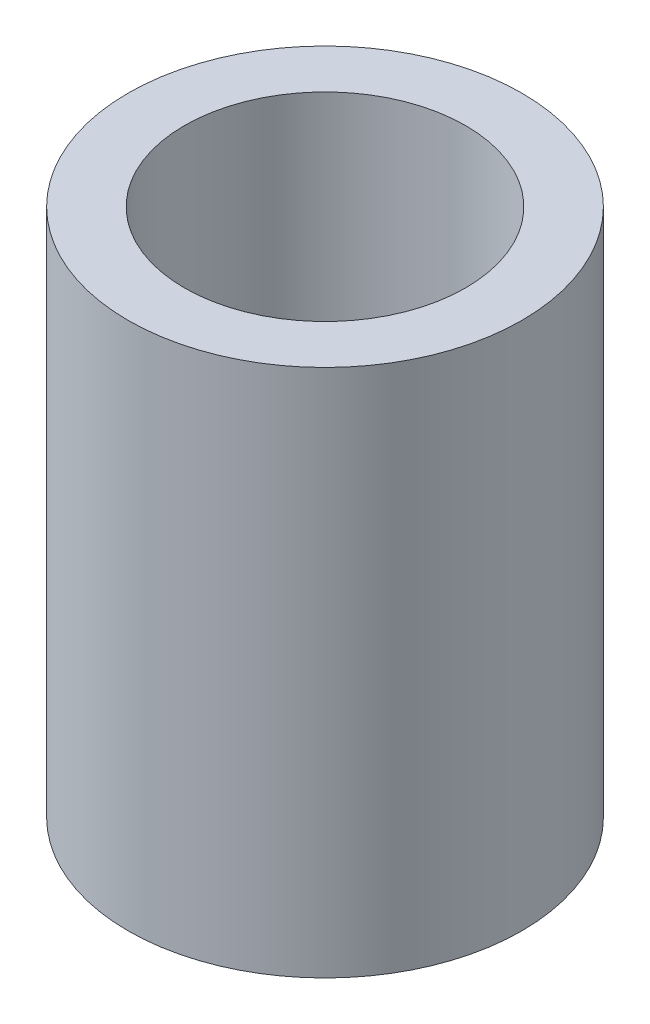
ISO-10303-21;
HEADER;
FILE_DESCRIPTION(('STEP AP214'),'2;1');
FILE_NAME('part.step','',(''),(''),'','','');
FILE_SCHEMA(('AUTOMOTIVE_DESIGN { 1 0 10303 214 1 1 1 1 }'));
ENDSEC;
DATA;
#1=APPLICATION_CONTEXT('core data for automotive mechanical design processes');
#2=APPLICATION_PROTOCOL_DEFINITION('international standard','automotive_design',2000,#1);
#3=PRODUCT_CONTEXT('',#1,'mechanical');
#4=PRODUCT('Part','Part','',(#3));
#5=PRODUCT_RELATED_PRODUCT_CATEGORY('part','',(#4));
#6=PRODUCT_DEFINITION_FORMATION('','',#4);
#7=PRODUCT_DEFINITION_CONTEXT('part definition',#1,'design');
#8=PRODUCT_DEFINITION('design','',#6,#7);
#9=PRODUCT_DEFINITION_SHAPE('','',#8);
#10=(LENGTH_UNIT() NAMED_UNIT(*) SI_UNIT(.MILLI.,.METRE.));
#11=(NAMED_UNIT(*) PLANE_ANGLE_UNIT() SI_UNIT($,.RADIAN.));
#12=(NAMED_UNIT(*) SI_UNIT($,.STERADIAN.) SOLID_ANGLE_UNIT());
#13=UNCERTAINTY_MEASURE_WITH_UNIT(LENGTH_MEASURE(1.E-05),#10,'distance_accuracy_value','');
#14=(GEOMETRIC_REPRESENTATION_CONTEXT(3) GLOBAL_UNCERTAINTY_ASSIGNED_CONTEXT((#13)) GLOBAL_UNIT_ASSIGNED_CONTEXT((#10,
#11,#12)) REPRESENTATION_CONTEXT('',''));
#15=CARTESIAN_POINT('',(0.,0.,0.));
#16=DIRECTION('',(0.,0.,1.));
#17=DIRECTION('',(1.,0.,0.));
#18=AXIS2_PLACEMENT_3D('',#15,#16,#17);
#19=CARTESIAN_POINT('',(0.,9.4,0.));
#20=DIRECTION('',(0.,1.,0.));
#21=DIRECTION('',(0.,0.,1.));
#22=AXIS2_PLACEMENT_3D('',#19,#20,#21);
#23=PLANE('',#22);
#24=CARTESIAN_POINT('',(0.,9.4,0.));
#25=DIRECTION('',(0.,1.,0.));
#26=DIRECTION('',(1.,0.,0.));
#27=AXIS2_PLACEMENT_3D('',#24,#25,#26);
#28=CIRCLE('',#27,3.5);
#29=CARTESIAN_POINT('',(3.5,9.4,0.));
#30=VERTEX_POINT('',#29);
#31=EDGE_CURVE('E11',#30,#30,#28,.T.);
#32=ORIENTED_EDGE('',*,*,#31,.T.);
#33=EDGE_LOOP('',(#32));
#34=FACE_BOUND('',#33,.T.);
#35=CARTESIAN_POINT('',(0.,9.4,0.));
#36=DIRECTION('',(0.,1.,0.));
#37=DIRECTION('',(0.,0.,1.));
#38=AXIS2_PLACEMENT_3D('',#35,#36,#37);
#39=CIRCLE('',#38,2.5);
#40=CARTESIAN_POINT('',(0.,9.4,2.5));
#41=VERTEX_POINT('',#40);
#42=EDGE_CURVE('E48',#41,#41,#39,.T.);
#43=ORIENTED_EDGE('',*,*,#42,.F.);
#44=EDGE_LOOP('',(#43));
#45=FACE_BOUND('',#44,.T.);
#46=ADVANCED_FACE('F37',(#34,#45),#23,.T.);
#47=CARTESIAN_POINT('',(0.,0.,0.));
#48=DIRECTION('',(0.,1.,0.));
#49=DIRECTION('',(0.,0.,1.));
#50=AXIS2_PLACEMENT_3D('',#47,#48,#49);
#51=PLANE('',#50);
#52=CARTESIAN_POINT('',(0.,0.,0.));
#53=DIRECTION('',(0.,1.,0.));
#54=DIRECTION('',(1.,0.,0.));
#55=AXIS2_PLACEMENT_3D('',#52,#53,#54);
#56=CIRCLE('',#55,3.5);
#57=CARTESIAN_POINT('',(3.5,0.,0.));
#58=VERTEX_POINT('',#57);
#59=EDGE_CURVE('E41',#58,#58,#56,.T.);
#60=ORIENTED_EDGE('',*,*,#59,.F.);
#61=EDGE_LOOP('',(#60));
#62=FACE_BOUND('',#61,.T.);
#63=CARTESIAN_POINT('',(0.,0.,0.));
#64=DIRECTION('',(0.,1.,0.));
#65=DIRECTION('',(0.,0.,1.));
#66=AXIS2_PLACEMENT_3D('',#63,#64,#65);
#67=CIRCLE('',#66,2.5);
#68=CARTESIAN_POINT('',(0.,0.,2.5));
#69=VERTEX_POINT('',#68);
#70=EDGE_CURVE('E50',#69,#69,#67,.T.);
#71=ORIENTED_EDGE('',*,*,#70,.T.);
#72=EDGE_LOOP('',(#71));
#73=FACE_BOUND('',#72,.T.);
#74=ADVANCED_FACE('F60',(#62,#73),#51,.F.);
#75=CARTESIAN_POINT('',(0.,9.4,0.));
#76=DIRECTION('',(0.,-1.,0.));
#77=DIRECTION('',(0.,0.,-1.));
#78=AXIS2_PLACEMENT_3D('',#75,#76,#77);
#79=CYLINDRICAL_SURFACE('',#78,3.5);
#80=ORIENTED_EDGE('',*,*,#31,.F.);
#81=EDGE_LOOP('',(#80));
#82=FACE_BOUND('',#81,.T.);
#83=ORIENTED_EDGE('',*,*,#59,.T.);
#84=EDGE_LOOP('',(#83));
#85=FACE_BOUND('',#84,.T.);
#86=ADVANCED_FACE('F39',(#82,#85),#79,.T.);
#87=CARTESIAN_POINT('',(0.,9.4,0.));
#88=DIRECTION('',(0.,-1.,0.));
#89=DIRECTION('',(0.,0.,-1.));
#90=AXIS2_PLACEMENT_3D('',#87,#88,#89);
#91=CYLINDRICAL_SURFACE('',#90,2.5);
#92=ORIENTED_EDGE('',*,*,#42,.T.);
#93=EDGE_LOOP('',(#92));
#94=FACE_BOUND('',#93,.T.);
#95=ORIENTED_EDGE('',*,*,#70,.F.);
#96=EDGE_LOOP('',(#95));
#97=FACE_BOUND('',#96,.T.);
#98=ADVANCED_FACE('F56',(#94,#97),#91,.F.);
#99=CLOSED_SHELL('',(#46,#74,#86,#98));
#100=MANIFOLD_SOLID_BREP('B2',#99);
#101=ADVANCED_BREP_SHAPE_REPRESENTATION('',(#18,#100),#14);
#102=SHAPE_DEFINITION_REPRESENTATION(#9,#101);
ENDSEC;
END-ISO-10303-21;
